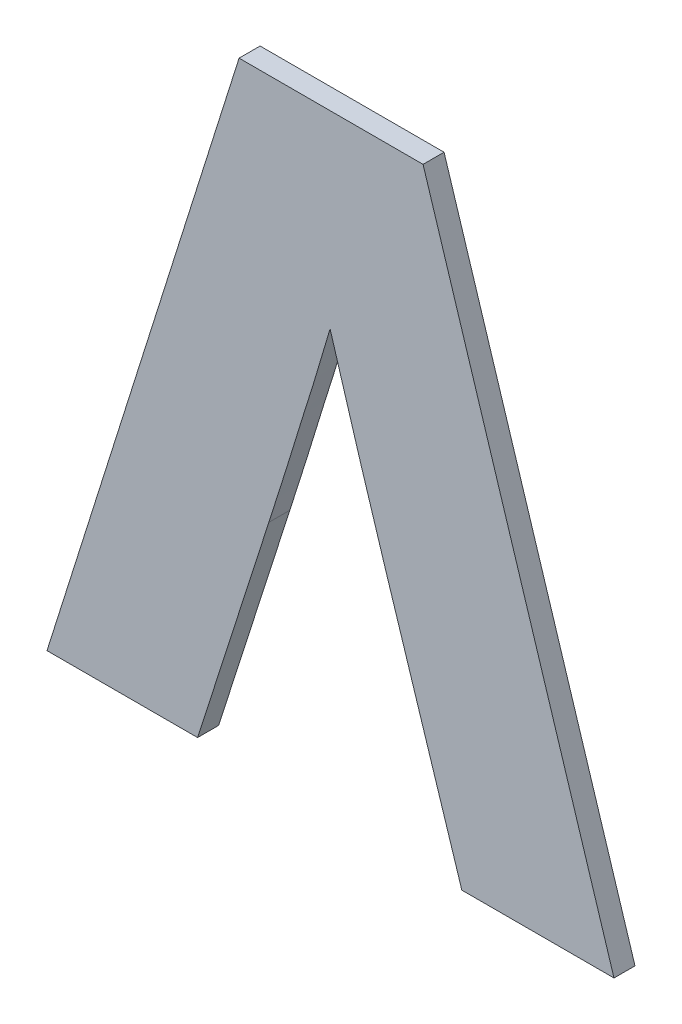
ISO-10303-21;
HEADER;
FILE_DESCRIPTION(('STEP AP214'),'2;1');
FILE_NAME('part.step','',(''),(''),'','','');
FILE_SCHEMA(('AUTOMOTIVE_DESIGN { 1 0 10303 214 1 1 1 1 }'));
ENDSEC;
DATA;
#1=APPLICATION_CONTEXT('core data for automotive mechanical design processes');
#2=APPLICATION_PROTOCOL_DEFINITION('international standard','automotive_design',2000,#1);
#3=PRODUCT_CONTEXT('',#1,'mechanical');
#4=PRODUCT('Part','Part','',(#3));
#5=PRODUCT_RELATED_PRODUCT_CATEGORY('part','',(#4));
#6=PRODUCT_DEFINITION_FORMATION('','',#4);
#7=PRODUCT_DEFINITION_CONTEXT('part definition',#1,'design');
#8=PRODUCT_DEFINITION('design','',#6,#7);
#9=PRODUCT_DEFINITION_SHAPE('','',#8);
#10=(LENGTH_UNIT() NAMED_UNIT(*) SI_UNIT(.MILLI.,.METRE.));
#11=(NAMED_UNIT(*) PLANE_ANGLE_UNIT() SI_UNIT($,.RADIAN.));
#12=(NAMED_UNIT(*) SI_UNIT($,.STERADIAN.) SOLID_ANGLE_UNIT());
#13=UNCERTAINTY_MEASURE_WITH_UNIT(LENGTH_MEASURE(1.E-05),#10,'distance_accuracy_value','');
#14=(GEOMETRIC_REPRESENTATION_CONTEXT(3) GLOBAL_UNCERTAINTY_ASSIGNED_CONTEXT((#13)) GLOBAL_UNIT_ASSIGNED_CONTEXT((#10,
#11,#12)) REPRESENTATION_CONTEXT('',''));
#15=CARTESIAN_POINT('',(0.,0.,0.));
#16=DIRECTION('',(0.,0.,1.));
#17=DIRECTION('',(1.,0.,0.));
#18=AXIS2_PLACEMENT_3D('',#15,#16,#17);
#19=CARTESIAN_POINT('',(0.,10.5021634615385,0.5));
#20=CARTESIAN_POINT('',(-0.0414617674922121,10.361302722397,0.5));
#21=CARTESIAN_POINT('',(-0.12969506017844,10.0615420615184,0.5));
#22=CARTESIAN_POINT('',(-0.272735332124097,9.59021980704995,0.5));
#23=CARTESIAN_POINT('',(-0.42493425403407,9.06864869669069,0.5));
#24=CARTESIAN_POINT('',(-0.607069711259125,8.50579368725389,0.5));
#25=CARTESIAN_POINT('',(-0.796924369731008,7.89282535036841,0.5));
#26=CARTESIAN_POINT('',(-0.99620154253462,7.23025273643762,0.5));
#27=CARTESIAN_POINT('',(-1.22606388076005,6.52469083840185,0.5));
#28=CARTESIAN_POINT('',(-1.37881889222726,6.03621949186577,0.5));
#29=CARTESIAN_POINT('',(-1.45763221153846,5.78419471153846,0.5));
#30=B_SPLINE_CURVE_WITH_KNOTS('',3,(#19,#20,#21,#22,#23,#24,#25,#26,#27,#28,#29),.UNSPECIFIED.,
.F.,.F.,(4,1,1,1,1,1,1,1,4),(0.,0.0892047702332458,0.189833455664349,0.299232591974981,
0.419260937842906,0.549207390190939,0.689074363684349,0.839579197948318,1.),.UNSPECIFIED.);
#31=DIRECTION('',(0.,0.,1.));
#32=VECTOR('',#31,1.);
#33=SURFACE_OF_LINEAR_EXTRUSION('',#30,#32);
#34=CARTESIAN_POINT('',(0.,10.5021634615385,1.));
#35=CARTESIAN_POINT('',(-0.0414617674922121,10.361302722397,1.));
#36=CARTESIAN_POINT('',(-0.12969506017844,10.0615420615184,1.));
#37=CARTESIAN_POINT('',(-0.272735332124097,9.59021980704995,1.));
#38=CARTESIAN_POINT('',(-0.42493425403407,9.06864869669069,1.));
#39=CARTESIAN_POINT('',(-0.607069711259125,8.50579368725389,1.));
#40=CARTESIAN_POINT('',(-0.796924369731008,7.89282535036841,1.));
#41=CARTESIAN_POINT('',(-0.99620154253462,7.23025273643762,1.));
#42=CARTESIAN_POINT('',(-1.22606388076005,6.52469083840185,1.));
#43=CARTESIAN_POINT('',(-1.37881889222726,6.03621949186577,1.));
#44=CARTESIAN_POINT('',(-1.45763221153846,5.78419471153846,1.));
#45=B_SPLINE_CURVE_WITH_KNOTS('',3,(#34,#35,#36,#37,#38,#39,#40,#41,#42,#43,#44),.UNSPECIFIED.,
.F.,.F.,(4,1,1,1,1,1,1,1,4),(0.,0.0892047702332458,0.189833455664349,0.299232591974981,
0.419260937842906,0.549207390190939,0.689074363684349,0.839579197948318,1.),.UNSPECIFIED.);
#46=CARTESIAN_POINT('',(0.,10.5021634615385,1.));
#47=VERTEX_POINT('',#46);
#48=CARTESIAN_POINT('',(-1.45763221153846,5.78419471153846,1.));
#49=VERTEX_POINT('',#48);
#50=EDGE_CURVE('E133',#47,#49,#45,.T.);
#51=ORIENTED_EDGE('',*,*,#50,.T.);
#52=DIRECTION('',(0.,0.,1.));
#53=VECTOR('',#52,1.);
#54=CARTESIAN_POINT('',(-1.45763221153846,5.78419471153846,0.5));
#55=LINE('',#54,#53);
#56=CARTESIAN_POINT('',(-1.45763221153846,5.78419471153846,0.5));
#57=VERTEX_POINT('',#56);
#58=EDGE_CURVE('E147',#57,#49,#55,.T.);
#59=ORIENTED_EDGE('',*,*,#58,.F.);
#60=CARTESIAN_POINT('',(0.,10.5021634615385,0.5));
#61=VERTEX_POINT('',#60);
#62=EDGE_CURVE('E176',#61,#57,#30,.T.);
#63=ORIENTED_EDGE('',*,*,#62,.F.);
#64=DIRECTION('',(0.,0.,1.));
#65=VECTOR('',#64,1.);
#66=CARTESIAN_POINT('',(0.,10.5021634615385,0.5));
#67=LINE('',#66,#65);
#68=EDGE_CURVE('E149',#61,#47,#67,.T.);
#69=ORIENTED_EDGE('',*,*,#68,.T.);
#70=EDGE_LOOP('',(#51,#59,#63,#69));
#71=FACE_BOUND('',#70,.T.);
#72=ADVANCED_FACE('F39',(#71),#33,.F.);
#73=CARTESIAN_POINT('',(1.33864182692307,6.14116586538461,0.5));
#74=CARTESIAN_POINT('',(1.26557204826301,6.37725995390912,0.5));
#75=CARTESIAN_POINT('',(1.12425934987284,6.83385217760499,0.5));
#76=CARTESIAN_POINT('',(0.914709383727786,7.49321336245061,0.5));
#77=CARTESIAN_POINT('',(0.724054044672674,8.10594178749488,0.5));
#78=CARTESIAN_POINT('',(0.552338890067038,8.67398779963672,0.5));
#79=CARTESIAN_POINT('',(0.390289080146147,9.19453107639541,0.5));
#80=CARTESIAN_POINT('',(0.24997947841851,9.67184305928834,0.5));
#81=CARTESIAN_POINT('',(0.115838934383688,10.1006197511101,0.5));
#82=CARTESIAN_POINT('',(0.0372265815547941,10.3731213586945,0.5));
#83=CARTESIAN_POINT('',(0.,10.5021634615385,0.5));
#84=B_SPLINE_CURVE_WITH_KNOTS('',3,(#73,#74,#75,#76,#77,#78,#79,#80,#81,#82,#83),.UNSPECIFIED.,
.F.,.F.,(4,1,1,1,1,1,1,1,4),(0.,0.162525521704187,0.314314898039237,0.454978490546575,
0.5845192373662,0.704567103309073,0.813494989728929,0.911681259682607,1.),.UNSPECIFIED.);
#85=DIRECTION('',(0.,0.,1.));
#86=VECTOR('',#85,1.);
#87=SURFACE_OF_LINEAR_EXTRUSION('',#84,#86);
#88=CARTESIAN_POINT('',(1.33864182692307,6.14116586538461,1.));
#89=CARTESIAN_POINT('',(1.26557204826301,6.37725995390912,1.));
#90=CARTESIAN_POINT('',(1.12425934987284,6.83385217760499,1.));
#91=CARTESIAN_POINT('',(0.914709383727786,7.49321336245061,1.));
#92=CARTESIAN_POINT('',(0.724054044672674,8.10594178749488,1.));
#93=CARTESIAN_POINT('',(0.552338890067038,8.67398779963672,1.));
#94=CARTESIAN_POINT('',(0.390289080146147,9.19453107639541,1.));
#95=CARTESIAN_POINT('',(0.24997947841851,9.67184305928834,1.));
#96=CARTESIAN_POINT('',(0.115838934383688,10.1006197511101,1.));
#97=CARTESIAN_POINT('',(0.0372265815547941,10.3731213586945,1.));
#98=CARTESIAN_POINT('',(0.,10.5021634615385,1.));
#99=B_SPLINE_CURVE_WITH_KNOTS('',3,(#88,#89,#90,#91,#92,#93,#94,#95,#96,#97,#98),.UNSPECIFIED.,
.F.,.F.,(4,1,1,1,1,1,1,1,4),(0.,0.162525521704187,0.314314898039237,0.454978490546575,
0.5845192373662,0.704567103309073,0.813494989728929,0.911681259682607,1.),.UNSPECIFIED.);
#100=CARTESIAN_POINT('',(1.33864182692307,6.14116586538461,1.));
#101=VERTEX_POINT('',#100);
#102=EDGE_CURVE('E227',#101,#47,#99,.T.);
#103=ORIENTED_EDGE('',*,*,#102,.T.);
#104=ORIENTED_EDGE('',*,*,#68,.F.);
#105=CARTESIAN_POINT('',(1.33864182692307,6.14116586538461,0.5));
#106=VERTEX_POINT('',#105);
#107=EDGE_CURVE('E173',#106,#61,#84,.T.);
#108=ORIENTED_EDGE('',*,*,#107,.F.);
#109=DIRECTION('',(0.,0.,1.));
#110=VECTOR('',#109,1.);
#111=CARTESIAN_POINT('',(1.33864182692307,6.14116586538461,0.5));
#112=LINE('',#111,#110);
#113=EDGE_CURVE('E43',#106,#101,#112,.T.);
#114=ORIENTED_EDGE('',*,*,#113,.T.);
#115=EDGE_LOOP('',(#103,#104,#108,#114));
#116=FACE_BOUND('',#115,.T.);
#117=ADVANCED_FACE('F182',(#116),#87,.F.);
#118=CARTESIAN_POINT('',(-2.165625,15.,0.5));
#119=DIRECTION('',(0.,-1.,0.));
#120=DIRECTION('',(0.,0.,-1.));
#121=AXIS2_PLACEMENT_3D('',#118,#119,#120);
#122=PLANE('',#121);
#123=DIRECTION('',(1.,0.,0.));
#124=VECTOR('',#123,1.);
#125=CARTESIAN_POINT('',(-2.165625,15.,1.));
#126=LINE('',#125,#124);
#127=CARTESIAN_POINT('',(-2.165625,15.,1.));
#128=VERTEX_POINT('',#127);
#129=CARTESIAN_POINT('',(2.21322115384615,15.,1.));
#130=VERTEX_POINT('',#129);
#131=EDGE_CURVE('E126',#128,#130,#126,.T.);
#132=ORIENTED_EDGE('',*,*,#131,.T.);
#133=DIRECTION('',(0.,0.,1.));
#134=VECTOR('',#133,1.);
#135=CARTESIAN_POINT('',(2.21322115384615,15.,0.5));
#136=LINE('',#135,#134);
#137=CARTESIAN_POINT('',(2.21322115384615,15.,0.5));
#138=VERTEX_POINT('',#137);
#139=EDGE_CURVE('E139',#138,#130,#136,.T.);
#140=ORIENTED_EDGE('',*,*,#139,.F.);
#141=DIRECTION('',(1.,0.,0.));
#142=VECTOR('',#141,1.);
#143=CARTESIAN_POINT('',(-2.165625,15.,0.5));
#144=LINE('',#143,#142);
#145=CARTESIAN_POINT('',(-2.165625,15.,0.5));
#146=VERTEX_POINT('',#145);
#147=EDGE_CURVE('E225',#146,#138,#144,.T.);
#148=ORIENTED_EDGE('',*,*,#147,.F.);
#149=DIRECTION('',(0.,0.,1.));
#150=VECTOR('',#149,1.);
#151=CARTESIAN_POINT('',(-2.165625,15.,0.5));
#152=LINE('',#151,#150);
#153=EDGE_CURVE('E142',#146,#128,#152,.T.);
#154=ORIENTED_EDGE('',*,*,#153,.T.);
#155=EDGE_LOOP('',(#132,#140,#148,#154));
#156=FACE_BOUND('',#155,.T.);
#157=ADVANCED_FACE('F190',(#156),#122,.F.);
#158=CARTESIAN_POINT('',(0.659899487595896,8.31878205226073,0.5));
#159=DIRECTION('',(0.,0.,-1.));
#160=DIRECTION('',(-1.,0.,0.));
#161=AXIS2_PLACEMENT_3D('',#158,#159,#160);
#162=PLANE('',#161);
#163=DIRECTION('',(1.,0.,0.));
#164=VECTOR('',#163,1.);
#165=CARTESIAN_POINT('',(0.659899487595896,0.5,0.5));
#166=LINE('',#165,#164);
#167=CARTESIAN_POINT('',(-6.73806818181819,0.5,0.5));
#168=VERTEX_POINT('',#167);
#169=CARTESIAN_POINT('',(-3.15354715671709,0.500000000000001,0.5));
#170=VERTEX_POINT('',#169);
#171=EDGE_CURVE('E121',#168,#170,#166,.T.);
#172=ORIENTED_EDGE('',*,*,#171,.F.);
#173=DIRECTION('',(0.300742337202367,0.953705429686786,0.));
#174=VECTOR('',#173,1.);
#175=CARTESIAN_POINT('',(-10.0903846153846,-10.1307692307692,0.5));
#176=LINE('',#175,#174);
#177=EDGE_CURVE('E122',#168,#146,#176,.T.);
#178=ORIENTED_EDGE('',*,*,#177,.T.);
#179=ORIENTED_EDGE('',*,*,#147,.T.);
#180=DIRECTION('',(0.299098108650077,-0.954222364756741,0.));
#181=VECTOR('',#180,1.);
#182=CARTESIAN_POINT('',(2.21322115384615,15.,0.5));
#183=LINE('',#182,#181);
#184=CARTESIAN_POINT('',(6.75820221445221,0.5,0.5));
#185=VERTEX_POINT('',#184);
#186=EDGE_CURVE('E143',#138,#185,#183,.T.);
#187=ORIENTED_EDGE('',*,*,#186,.T.);
#188=CARTESIAN_POINT('',(3.13582741235534,0.5,0.5));
#189=VERTEX_POINT('',#188);
#190=EDGE_CURVE('E165',#189,#185,#166,.T.);
#191=ORIENTED_EDGE('',*,*,#190,.F.);
#192=DIRECTION('',(-0.303551674204234,0.95281497736329,0.));
#193=VECTOR('',#192,1.);
#194=CARTESIAN_POINT('',(7.97830528846154,-14.7,0.5));
#195=LINE('',#194,#193);
#196=EDGE_CURVE('E137',#189,#106,#195,.T.);
#197=ORIENTED_EDGE('',*,*,#196,.T.);
#198=ORIENTED_EDGE('',*,*,#107,.T.);
#199=ORIENTED_EDGE('',*,*,#62,.T.);
#200=DIRECTION('',(-0.305588409967658,-0.952163706351717,0.));
#201=VECTOR('',#200,1.);
#202=CARTESIAN_POINT('',(-1.45763221153846,5.78419471153846,0.5));
#203=LINE('',#202,#201);
#204=EDGE_CURVE('E245',#57,#170,#203,.T.);
#205=ORIENTED_EDGE('',*,*,#204,.T.);
#206=EDGE_LOOP('',(#172,#178,#179,#187,#191,#197,#198,#199,#205));
#207=FACE_BOUND('',#206,.T.);
#208=ADVANCED_FACE('F196',(#207),#162,.T.);
#209=CARTESIAN_POINT('',(2.21322115384615,15.,0.5));
#210=DIRECTION('',(-0.954222364756741,-0.299098108650077,0.));
#211=DIRECTION('',(0.299098108650077,-0.954222364756741,0.));
#212=AXIS2_PLACEMENT_3D('',#209,#210,#211);
#213=PLANE('',#212);
#214=DIRECTION('',(0.299098108650077,-0.954222364756741,0.));
#215=VECTOR('',#214,1.);
#216=CARTESIAN_POINT('',(2.21322115384615,15.,1.));
#217=LINE('',#216,#215);
#218=CARTESIAN_POINT('',(6.75820221445221,0.5,1.));
#219=VERTEX_POINT('',#218);
#220=EDGE_CURVE('E131',#130,#219,#217,.T.);
#221=ORIENTED_EDGE('',*,*,#220,.T.);
#222=DIRECTION('',(0.,0.,-1.));
#223=VECTOR('',#222,1.);
#224=CARTESIAN_POINT('',(6.75820221445221,0.5,0.5));
#225=LINE('',#224,#223);
#226=EDGE_CURVE('E161',#219,#185,#225,.T.);
#227=ORIENTED_EDGE('',*,*,#226,.T.);
#228=ORIENTED_EDGE('',*,*,#186,.F.);
#229=ORIENTED_EDGE('',*,*,#139,.T.);
#230=EDGE_LOOP('',(#221,#227,#228,#229));
#231=FACE_BOUND('',#230,.T.);
#232=ADVANCED_FACE('F197',(#231),#213,.F.);
#233=CARTESIAN_POINT('',(-10.0903846153846,-10.1307692307692,0.5));
#234=DIRECTION('',(0.953705429686786,-0.300742337202367,0.));
#235=DIRECTION('',(0.300742337202367,0.953705429686786,0.));
#236=AXIS2_PLACEMENT_3D('',#233,#234,#235);
#237=PLANE('',#236);
#238=ORIENTED_EDGE('',*,*,#177,.F.);
#239=DIRECTION('',(0.,0.,1.));
#240=VECTOR('',#239,1.);
#241=CARTESIAN_POINT('',(-6.73806818181818,0.5,0.5));
#242=LINE('',#241,#240);
#243=CARTESIAN_POINT('',(-6.73806818181819,0.5,1.));
#244=VERTEX_POINT('',#243);
#245=EDGE_CURVE('E57',#168,#244,#242,.T.);
#246=ORIENTED_EDGE('',*,*,#245,.T.);
#247=DIRECTION('',(0.300742337202367,0.953705429686786,0.));
#248=VECTOR('',#247,1.);
#249=CARTESIAN_POINT('',(-10.0903846153846,-10.1307692307692,1.));
#250=LINE('',#249,#248);
#251=EDGE_CURVE('E118',#244,#128,#250,.T.);
#252=ORIENTED_EDGE('',*,*,#251,.T.);
#253=ORIENTED_EDGE('',*,*,#153,.F.);
#254=EDGE_LOOP('',(#238,#246,#252,#253));
#255=FACE_BOUND('',#254,.T.);
#256=ADVANCED_FACE('F120',(#255),#237,.F.);
#257=CARTESIAN_POINT('',(-1.45763221153846,5.78419471153846,0.5));
#258=DIRECTION('',(-0.952163706351717,0.305588409967658,0.));
#259=DIRECTION('',(-0.305588409967658,-0.952163706351717,0.));
#260=AXIS2_PLACEMENT_3D('',#257,#258,#259);
#261=PLANE('',#260);
#262=DIRECTION('',(-0.305588409967658,-0.952163706351717,0.));
#263=VECTOR('',#262,1.);
#264=CARTESIAN_POINT('',(-1.45763221153846,5.78419471153846,1.));
#265=LINE('',#264,#263);
#266=CARTESIAN_POINT('',(-3.15354715671709,0.5,1.));
#267=VERTEX_POINT('',#266);
#268=EDGE_CURVE('E129',#49,#267,#265,.T.);
#269=ORIENTED_EDGE('',*,*,#268,.T.);
#270=DIRECTION('',(0.,0.,-1.));
#271=VECTOR('',#270,1.);
#272=CARTESIAN_POINT('',(-3.15354715671709,0.5,0.5));
#273=LINE('',#272,#271);
#274=EDGE_CURVE('E112',#267,#170,#273,.T.);
#275=ORIENTED_EDGE('',*,*,#274,.T.);
#276=ORIENTED_EDGE('',*,*,#204,.F.);
#277=ORIENTED_EDGE('',*,*,#58,.T.);
#278=EDGE_LOOP('',(#269,#275,#276,#277));
#279=FACE_BOUND('',#278,.T.);
#280=ADVANCED_FACE('F189',(#279),#261,.F.);
#281=CARTESIAN_POINT('',(7.97830528846154,-14.7,0.5));
#282=DIRECTION('',(0.95281497736329,0.303551674204234,0.));
#283=DIRECTION('',(-0.303551674204234,0.95281497736329,0.));
#284=AXIS2_PLACEMENT_3D('',#281,#282,#283);
#285=PLANE('',#284);
#286=ORIENTED_EDGE('',*,*,#196,.F.);
#287=DIRECTION('',(0.,0.,1.));
#288=VECTOR('',#287,1.);
#289=CARTESIAN_POINT('',(3.13582741235534,0.5,0.5));
#290=LINE('',#289,#288);
#291=CARTESIAN_POINT('',(3.13582741235534,0.5,1.));
#292=VERTEX_POINT('',#291);
#293=EDGE_CURVE('E61',#189,#292,#290,.T.);
#294=ORIENTED_EDGE('',*,*,#293,.T.);
#295=DIRECTION('',(-0.303551674204234,0.95281497736329,0.));
#296=VECTOR('',#295,1.);
#297=CARTESIAN_POINT('',(7.97830528846154,-14.7,1.));
#298=LINE('',#297,#296);
#299=EDGE_CURVE('E170',#292,#101,#298,.T.);
#300=ORIENTED_EDGE('',*,*,#299,.T.);
#301=ORIENTED_EDGE('',*,*,#113,.F.);
#302=EDGE_LOOP('',(#286,#294,#300,#301));
#303=FACE_BOUND('',#302,.T.);
#304=ADVANCED_FACE('F41',(#303),#285,.F.);
#305=CARTESIAN_POINT('',(0.659899487595896,8.31878205226073,1.));
#306=DIRECTION('',(0.,0.,-1.));
#307=DIRECTION('',(-1.,0.,0.));
#308=AXIS2_PLACEMENT_3D('',#305,#306,#307);
#309=PLANE('',#308);
#310=ORIENTED_EDGE('',*,*,#251,.F.);
#311=DIRECTION('',(1.,0.,0.));
#312=VECTOR('',#311,1.);
#313=CARTESIAN_POINT('',(-17.,0.5,1.));
#314=LINE('',#313,#312);
#315=EDGE_CURVE('E11',#244,#267,#314,.T.);
#316=ORIENTED_EDGE('',*,*,#315,.T.);
#317=ORIENTED_EDGE('',*,*,#268,.F.);
#318=ORIENTED_EDGE('',*,*,#50,.F.);
#319=ORIENTED_EDGE('',*,*,#102,.F.);
#320=ORIENTED_EDGE('',*,*,#299,.F.);
#321=EDGE_CURVE('E48',#292,#219,#314,.T.);
#322=ORIENTED_EDGE('',*,*,#321,.T.);
#323=ORIENTED_EDGE('',*,*,#220,.F.);
#324=ORIENTED_EDGE('',*,*,#131,.F.);
#325=EDGE_LOOP('',(#310,#316,#317,#318,#319,#320,#322,#323,#324));
#326=FACE_BOUND('',#325,.T.);
#327=ADVANCED_FACE('F128',(#326),#309,.F.);
#328=CARTESIAN_POINT('',(-17.,0.5,1.));
#329=DIRECTION('',(0.,1.,0.));
#330=DIRECTION('',(0.,0.,1.));
#331=AXIS2_PLACEMENT_3D('',#328,#329,#330);
#332=PLANE('',#331);
#333=ORIENTED_EDGE('',*,*,#190,.T.);
#334=ORIENTED_EDGE('',*,*,#226,.F.);
#335=ORIENTED_EDGE('',*,*,#321,.F.);
#336=ORIENTED_EDGE('',*,*,#293,.F.);
#337=EDGE_LOOP('',(#333,#334,#335,#336));
#338=FACE_BOUND('',#337,.T.);
#339=ADVANCED_FACE('F207',(#338),#332,.F.);
#340=ORIENTED_EDGE('',*,*,#315,.F.);
#341=ORIENTED_EDGE('',*,*,#245,.F.);
#342=ORIENTED_EDGE('',*,*,#171,.T.);
#343=ORIENTED_EDGE('',*,*,#274,.F.);
#344=EDGE_LOOP('',(#340,#341,#342,#343));
#345=FACE_BOUND('',#344,.T.);
#346=ADVANCED_FACE('F106',(#345),#332,.F.);
#347=CLOSED_SHELL('',(#72,#117,#157,#208,#232,#256,#280,#304,#327,#339,#346));
#348=MANIFOLD_SOLID_BREP('B2',#347);
#349=ADVANCED_BREP_SHAPE_REPRESENTATION('',(#18,#348),#14);
#350=SHAPE_DEFINITION_REPRESENTATION(#9,#349);
ENDSEC;
END-ISO-10303-21;
